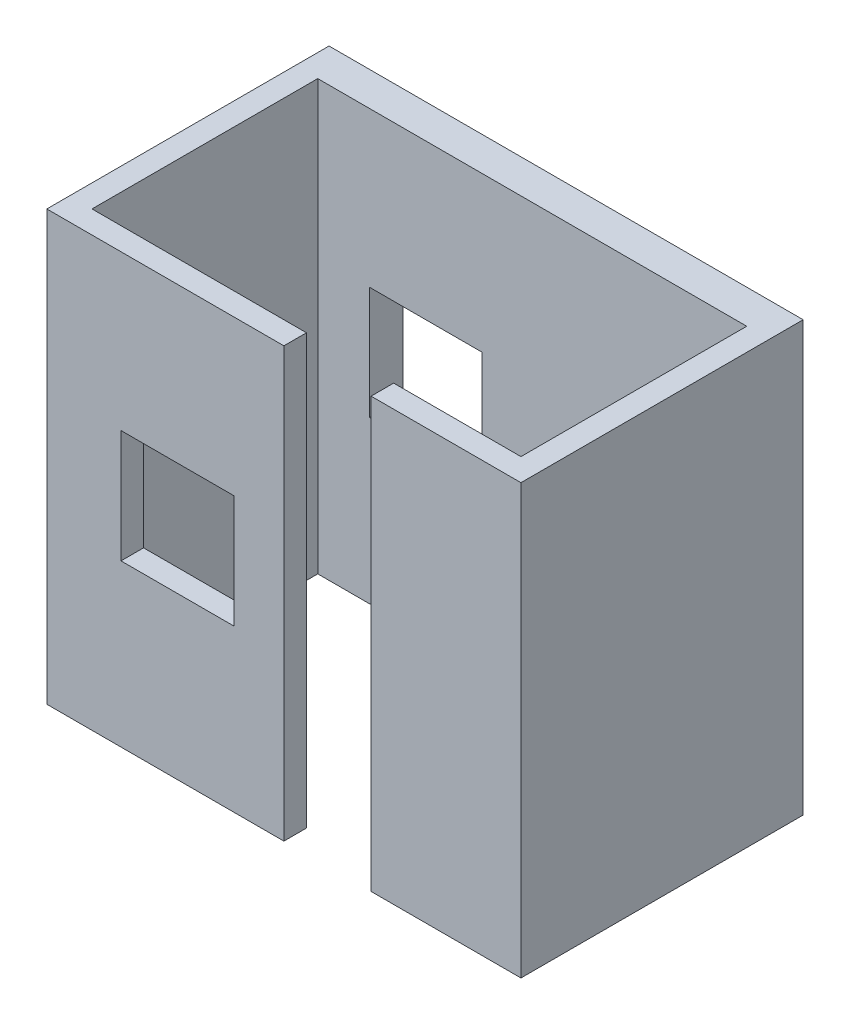
ISO-10303-21;
HEADER;
FILE_DESCRIPTION(('STEP AP214'),'2;1');
FILE_NAME('part.step','',(''),(''),'','','');
FILE_SCHEMA(('AUTOMOTIVE_DESIGN { 1 0 10303 214 1 1 1 1 }'));
ENDSEC;
DATA;
#1=APPLICATION_CONTEXT('core data for automotive mechanical design processes');
#2=APPLICATION_PROTOCOL_DEFINITION('international standard','automotive_design',2000,#1);
#3=PRODUCT_CONTEXT('',#1,'mechanical');
#4=PRODUCT('Part','Part','',(#3));
#5=PRODUCT_RELATED_PRODUCT_CATEGORY('part','',(#4));
#6=PRODUCT_DEFINITION_FORMATION('','',#4);
#7=PRODUCT_DEFINITION_CONTEXT('part definition',#1,'design');
#8=PRODUCT_DEFINITION('design','',#6,#7);
#9=PRODUCT_DEFINITION_SHAPE('','',#8);
#10=(LENGTH_UNIT() NAMED_UNIT(*) SI_UNIT(.MILLI.,.METRE.));
#11=(NAMED_UNIT(*) PLANE_ANGLE_UNIT() SI_UNIT($,.RADIAN.));
#12=(NAMED_UNIT(*) SI_UNIT($,.STERADIAN.) SOLID_ANGLE_UNIT());
#13=UNCERTAINTY_MEASURE_WITH_UNIT(LENGTH_MEASURE(1.E-05),#10,'distance_accuracy_value','');
#14=(GEOMETRIC_REPRESENTATION_CONTEXT(3) GLOBAL_UNCERTAINTY_ASSIGNED_CONTEXT((#13)) GLOBAL_UNIT_ASSIGNED_CONTEXT((#10,
#11,#12)) REPRESENTATION_CONTEXT('',''));
#15=CARTESIAN_POINT('',(0.,0.,0.));
#16=DIRECTION('',(0.,0.,1.));
#17=DIRECTION('',(1.,0.,0.));
#18=AXIS2_PLACEMENT_3D('',#15,#16,#17);
#19=CARTESIAN_POINT('',(-26.8167283653396,-11.0800335915836,1.5));
#20=DIRECTION('',(0.,1.,0.));
#21=DIRECTION('',(0.,0.,1.));
#22=AXIS2_PLACEMENT_3D('',#19,#20,#21);
#23=PLANE('',#22);
#24=DIRECTION('',(0.,0.,1.));
#25=VECTOR('',#24,1.);
#26=CARTESIAN_POINT('',(-17.3167283653395,-11.0800335915836,-17.8886346968364));
#27=LINE('',#26,#25);
#28=CARTESIAN_POINT('',(-17.3167283653395,-11.0800335915836,11.5));
#29=VERTEX_POINT('',#28);
#30=CARTESIAN_POINT('',(-17.3167283653395,-11.0800335915836,12.5));
#31=VERTEX_POINT('',#30);
#32=EDGE_CURVE('E171',#29,#31,#27,.T.);
#33=ORIENTED_EDGE('',*,*,#32,.T.);
#34=DIRECTION('',(-1.,0.,0.));
#35=VECTOR('',#34,1.);
#36=CARTESIAN_POINT('',(-27.8167283653395,-11.0800335915836,12.5));
#37=LINE('',#36,#35);
#38=CARTESIAN_POINT('',(-27.8167283653395,-11.0800335915836,12.5));
#39=VERTEX_POINT('',#38);
#40=EDGE_CURVE('E183',#31,#39,#37,.T.);
#41=ORIENTED_EDGE('',*,*,#40,.T.);
#42=DIRECTION('',(0.,0.,1.));
#43=VECTOR('',#42,1.);
#44=CARTESIAN_POINT('',(-27.8167283653395,-11.0800335915836,0.));
#45=LINE('',#44,#43);
#46=CARTESIAN_POINT('',(-27.8167283653395,-11.0800335915836,0.));
#47=VERTEX_POINT('',#46);
#48=EDGE_CURVE('E210',#47,#39,#45,.T.);
#49=ORIENTED_EDGE('',*,*,#48,.F.);
#50=DIRECTION('',(1.,0.,0.));
#51=VECTOR('',#50,1.);
#52=CARTESIAN_POINT('',(-26.8167283653396,-11.0800335915836,0.));
#53=LINE('',#52,#51);
#54=CARTESIAN_POINT('',(-6.81672836533955,-11.0800335915836,0.));
#55=VERTEX_POINT('',#54);
#56=EDGE_CURVE('E259',#47,#55,#53,.T.);
#57=ORIENTED_EDGE('',*,*,#56,.T.);
#58=DIRECTION('',(0.,0.,1.));
#59=VECTOR('',#58,1.);
#60=CARTESIAN_POINT('',(-6.81672836533955,-11.0800335915836,0.));
#61=LINE('',#60,#59);
#62=CARTESIAN_POINT('',(-6.81672836533955,-11.0800335915836,12.5));
#63=VERTEX_POINT('',#62);
#64=EDGE_CURVE('E287',#55,#63,#61,.T.);
#65=ORIENTED_EDGE('',*,*,#64,.T.);
#66=CARTESIAN_POINT('',(-13.4541961120931,-11.0800335915836,12.5));
#67=VERTEX_POINT('',#66);
#68=EDGE_CURVE('E193',#63,#67,#37,.T.);
#69=ORIENTED_EDGE('',*,*,#68,.T.);
#70=DIRECTION('',(0.,0.,1.));
#71=VECTOR('',#70,1.);
#72=CARTESIAN_POINT('',(-13.4541961120931,-11.0800335915836,-17.8886346968364));
#73=LINE('',#72,#71);
#74=CARTESIAN_POINT('',(-13.4541961120931,-11.0800335915836,11.5));
#75=VERTEX_POINT('',#74);
#76=EDGE_CURVE('E58',#75,#67,#73,.T.);
#77=ORIENTED_EDGE('',*,*,#76,.F.);
#78=DIRECTION('',(1.,0.,0.));
#79=VECTOR('',#78,1.);
#80=CARTESIAN_POINT('',(-27.8167283653395,-11.0800335915836,11.5));
#81=LINE('',#80,#79);
#82=CARTESIAN_POINT('',(-7.81672836533955,-11.0800335915836,11.5));
#83=VERTEX_POINT('',#82);
#84=EDGE_CURVE('E197',#75,#83,#81,.T.);
#85=ORIENTED_EDGE('',*,*,#84,.T.);
#86=DIRECTION('',(0.,0.,1.));
#87=VECTOR('',#86,1.);
#88=CARTESIAN_POINT('',(-7.81672836533955,-11.0800335915836,0.));
#89=LINE('',#88,#87);
#90=CARTESIAN_POINT('',(-7.81672836533955,-11.0800335915836,1.5));
#91=VERTEX_POINT('',#90);
#92=EDGE_CURVE('E223',#91,#83,#89,.T.);
#93=ORIENTED_EDGE('',*,*,#92,.F.);
#94=DIRECTION('',(1.,0.,0.));
#95=VECTOR('',#94,1.);
#96=CARTESIAN_POINT('',(-26.8167283653396,-11.0800335915836,1.5));
#97=LINE('',#96,#95);
#98=CARTESIAN_POINT('',(-26.8167283653396,-11.0800335915836,1.5));
#99=VERTEX_POINT('',#98);
#100=EDGE_CURVE('E272',#99,#91,#97,.T.);
#101=ORIENTED_EDGE('',*,*,#100,.F.);
#102=DIRECTION('',(0.,0.,1.));
#103=VECTOR('',#102,1.);
#104=CARTESIAN_POINT('',(-26.8167283653396,-11.0800335915836,0.));
#105=LINE('',#104,#103);
#106=CARTESIAN_POINT('',(-26.8167283653396,-11.0800335915836,11.5));
#107=VERTEX_POINT('',#106);
#108=EDGE_CURVE('E213',#99,#107,#105,.T.);
#109=ORIENTED_EDGE('',*,*,#108,.T.);
#110=EDGE_CURVE('E187',#107,#29,#81,.T.);
#111=ORIENTED_EDGE('',*,*,#110,.T.);
#112=EDGE_LOOP('',(#33,#41,#49,#57,#65,#69,#77,#85,#93,#101,#109,#111));
#113=FACE_BOUND('',#112,.T.);
#114=ADVANCED_FACE('F33',(#113),#23,.F.);
#115=CARTESIAN_POINT('',(-26.8167283653396,7.91996640841636,1.5));
#116=DIRECTION('',(0.,-1.,0.));
#117=DIRECTION('',(0.,0.,-1.));
#118=AXIS2_PLACEMENT_3D('',#115,#116,#117);
#119=PLANE('',#118);
#120=DIRECTION('',(0.,0.,1.));
#121=VECTOR('',#120,1.);
#122=CARTESIAN_POINT('',(-17.3167283653395,7.91996640841636,-17.8886346968364));
#123=LINE('',#122,#121);
#124=CARTESIAN_POINT('',(-17.3167283653395,7.91996640841636,11.5));
#125=VERTEX_POINT('',#124);
#126=CARTESIAN_POINT('',(-17.3167283653395,7.91996640841636,12.5));
#127=VERTEX_POINT('',#126);
#128=EDGE_CURVE('E50',#125,#127,#123,.T.);
#129=ORIENTED_EDGE('',*,*,#128,.F.);
#130=DIRECTION('',(-1.,0.,0.));
#131=VECTOR('',#130,1.);
#132=CARTESIAN_POINT('',(-27.8167283653395,7.91996640841636,11.5));
#133=LINE('',#132,#131);
#134=CARTESIAN_POINT('',(-26.8167283653396,7.91996640841636,11.5));
#135=VERTEX_POINT('',#134);
#136=EDGE_CURVE('E309',#125,#135,#133,.T.);
#137=ORIENTED_EDGE('',*,*,#136,.T.);
#138=DIRECTION('',(0.,0.,1.));
#139=VECTOR('',#138,1.);
#140=CARTESIAN_POINT('',(-26.8167283653396,7.91996640841636,0.));
#141=LINE('',#140,#139);
#142=CARTESIAN_POINT('',(-26.8167283653396,7.91996640841636,1.5));
#143=VERTEX_POINT('',#142);
#144=EDGE_CURVE('E207',#143,#135,#141,.T.);
#145=ORIENTED_EDGE('',*,*,#144,.F.);
#146=DIRECTION('',(-1.,0.,0.));
#147=VECTOR('',#146,1.);
#148=CARTESIAN_POINT('',(-26.8167283653396,7.91996640841636,1.5));
#149=LINE('',#148,#147);
#150=CARTESIAN_POINT('',(-7.81672836533955,7.91996640841636,1.5));
#151=VERTEX_POINT('',#150);
#152=EDGE_CURVE('E11',#151,#143,#149,.T.);
#153=ORIENTED_EDGE('',*,*,#152,.F.);
#154=DIRECTION('',(0.,0.,1.));
#155=VECTOR('',#154,1.);
#156=CARTESIAN_POINT('',(-7.81672836533955,7.91996640841636,0.));
#157=LINE('',#156,#155);
#158=CARTESIAN_POINT('',(-7.81672836533955,7.91996640841636,11.5));
#159=VERTEX_POINT('',#158);
#160=EDGE_CURVE('E229',#151,#159,#157,.T.);
#161=ORIENTED_EDGE('',*,*,#160,.T.);
#162=CARTESIAN_POINT('',(-13.4541961120931,7.91996640841636,11.5));
#163=VERTEX_POINT('',#162);
#164=EDGE_CURVE('E305',#159,#163,#133,.T.);
#165=ORIENTED_EDGE('',*,*,#164,.T.);
#166=DIRECTION('',(0.,0.,1.));
#167=VECTOR('',#166,1.);
#168=CARTESIAN_POINT('',(-13.4541961120931,7.91996640841636,-17.8886346968364));
#169=LINE('',#168,#167);
#170=CARTESIAN_POINT('',(-13.4541961120931,7.91996640841636,12.5));
#171=VERTEX_POINT('',#170);
#172=EDGE_CURVE('E177',#163,#171,#169,.T.);
#173=ORIENTED_EDGE('',*,*,#172,.T.);
#174=DIRECTION('',(1.,0.,0.));
#175=VECTOR('',#174,1.);
#176=CARTESIAN_POINT('',(-27.8167283653395,7.91996640841636,12.5));
#177=LINE('',#176,#175);
#178=CARTESIAN_POINT('',(-6.81672836533955,7.91996640841636,12.5));
#179=VERTEX_POINT('',#178);
#180=EDGE_CURVE('E302',#171,#179,#177,.T.);
#181=ORIENTED_EDGE('',*,*,#180,.T.);
#182=DIRECTION('',(0.,0.,1.));
#183=VECTOR('',#182,1.);
#184=CARTESIAN_POINT('',(-6.81672836533955,7.91996640841636,0.));
#185=LINE('',#184,#183);
#186=CARTESIAN_POINT('',(-6.81672836533955,7.91996640841636,0.));
#187=VERTEX_POINT('',#186);
#188=EDGE_CURVE('E226',#187,#179,#185,.T.);
#189=ORIENTED_EDGE('',*,*,#188,.F.);
#190=DIRECTION('',(-1.,0.,0.));
#191=VECTOR('',#190,1.);
#192=CARTESIAN_POINT('',(-26.8167283653396,7.91996640841636,0.));
#193=LINE('',#192,#191);
#194=CARTESIAN_POINT('',(-27.8167283653395,7.91996640841636,0.));
#195=VERTEX_POINT('',#194);
#196=EDGE_CURVE('E273',#187,#195,#193,.T.);
#197=ORIENTED_EDGE('',*,*,#196,.T.);
#198=DIRECTION('',(0.,0.,1.));
#199=VECTOR('',#198,1.);
#200=CARTESIAN_POINT('',(-27.8167283653395,7.91996640841636,0.));
#201=LINE('',#200,#199);
#202=CARTESIAN_POINT('',(-27.8167283653395,7.91996640841636,12.5));
#203=VERTEX_POINT('',#202);
#204=EDGE_CURVE('E367',#195,#203,#201,.T.);
#205=ORIENTED_EDGE('',*,*,#204,.T.);
#206=EDGE_CURVE('E310',#203,#127,#177,.T.);
#207=ORIENTED_EDGE('',*,*,#206,.T.);
#208=EDGE_LOOP('',(#129,#137,#145,#153,#161,#165,#173,#181,#189,#197,#205,#207));
#209=FACE_BOUND('',#208,.T.);
#210=ADVANCED_FACE('F299',(#209),#119,.F.);
#211=CARTESIAN_POINT('',(-27.8167283653395,-32.1038296332123,11.5));
#212=DIRECTION('',(0.,0.,-1.));
#213=DIRECTION('',(-1.,0.,0.));
#214=AXIS2_PLACEMENT_3D('',#211,#212,#213);
#215=PLANE('',#214);
#216=DIRECTION('',(0.,-1.,0.));
#217=VECTOR('',#216,1.);
#218=CARTESIAN_POINT('',(-19.5312867109825,1.06264686566049,11.5));
#219=LINE('',#218,#217);
#220=CARTESIAN_POINT('',(-19.5312867109825,1.06264686566049,11.5));
#221=VERTEX_POINT('',#220);
#222=CARTESIAN_POINT('',(-19.5312867109825,-3.93735313433951,11.5));
#223=VERTEX_POINT('',#222);
#224=EDGE_CURVE('E332',#221,#223,#219,.T.);
#225=ORIENTED_EDGE('',*,*,#224,.F.);
#226=DIRECTION('',(1.,0.,0.));
#227=VECTOR('',#226,1.);
#228=CARTESIAN_POINT('',(-19.5312867109825,1.06264686566049,11.5));
#229=LINE('',#228,#227);
#230=CARTESIAN_POINT('',(-24.5312867109825,1.06264686566049,11.5));
#231=VERTEX_POINT('',#230);
#232=EDGE_CURVE('E322',#231,#221,#229,.T.);
#233=ORIENTED_EDGE('',*,*,#232,.F.);
#234=DIRECTION('',(0.,1.,0.));
#235=VECTOR('',#234,1.);
#236=CARTESIAN_POINT('',(-24.5312867109825,1.06264686566049,11.5));
#237=LINE('',#236,#235);
#238=CARTESIAN_POINT('',(-24.5312867109825,-3.93735313433951,11.5));
#239=VERTEX_POINT('',#238);
#240=EDGE_CURVE('E326',#239,#231,#237,.T.);
#241=ORIENTED_EDGE('',*,*,#240,.F.);
#242=DIRECTION('',(-1.,0.,0.));
#243=VECTOR('',#242,1.);
#244=CARTESIAN_POINT('',(-19.5312867109825,-3.93735313433951,11.5));
#245=LINE('',#244,#243);
#246=EDGE_CURVE('E329',#223,#239,#245,.T.);
#247=ORIENTED_EDGE('',*,*,#246,.F.);
#248=EDGE_LOOP('',(#225,#233,#241,#247));
#249=FACE_BOUND('',#248,.T.);
#250=ORIENTED_EDGE('',*,*,#136,.F.);
#251=DIRECTION('',(0.,-1.,0.));
#252=VECTOR('',#251,1.);
#253=CARTESIAN_POINT('',(-17.3167283653395,-32.1038296332123,11.5));
#254=LINE('',#253,#252);
#255=EDGE_CURVE('E334',#125,#29,#254,.T.);
#256=ORIENTED_EDGE('',*,*,#255,.T.);
#257=ORIENTED_EDGE('',*,*,#110,.F.);
#258=DIRECTION('',(0.,1.,0.));
#259=VECTOR('',#258,1.);
#260=CARTESIAN_POINT('',(-26.8167283653396,7.91996640841636,11.5));
#261=LINE('',#260,#259);
#262=EDGE_CURVE('E196',#107,#135,#261,.T.);
#263=ORIENTED_EDGE('',*,*,#262,.T.);
#264=EDGE_LOOP('',(#250,#256,#257,#263));
#265=FACE_BOUND('',#264,.T.);
#266=ADVANCED_FACE('F364',(#249,#265),#215,.T.);
#267=ORIENTED_EDGE('',*,*,#84,.F.);
#268=DIRECTION('',(0.,1.,0.));
#269=VECTOR('',#268,1.);
#270=CARTESIAN_POINT('',(-13.4541961120931,-32.1038296332123,11.5));
#271=LINE('',#270,#269);
#272=EDGE_CURVE('E346',#75,#163,#271,.T.);
#273=ORIENTED_EDGE('',*,*,#272,.T.);
#274=ORIENTED_EDGE('',*,*,#164,.F.);
#275=DIRECTION('',(0.,-1.,0.));
#276=VECTOR('',#275,1.);
#277=CARTESIAN_POINT('',(-7.81672836533955,7.91996640841636,11.5));
#278=LINE('',#277,#276);
#279=EDGE_CURVE('E216',#159,#83,#278,.T.);
#280=ORIENTED_EDGE('',*,*,#279,.T.);
#281=EDGE_LOOP('',(#267,#273,#274,#280));
#282=FACE_BOUND('',#281,.T.);
#283=ADVANCED_FACE('F356',(#282),#215,.T.);
#284=CARTESIAN_POINT('',(-27.8167283653395,-32.1038296332123,12.5));
#285=DIRECTION('',(0.,0.,1.));
#286=DIRECTION('',(1.,0.,0.));
#287=AXIS2_PLACEMENT_3D('',#284,#285,#286);
#288=PLANE('',#287);
#289=DIRECTION('',(0.,-1.,0.));
#290=VECTOR('',#289,1.);
#291=CARTESIAN_POINT('',(-19.5312867109825,1.06264686566049,12.5));
#292=LINE('',#291,#290);
#293=CARTESIAN_POINT('',(-19.5312867109825,1.06264686566049,12.5));
#294=VERTEX_POINT('',#293);
#295=CARTESIAN_POINT('',(-19.5312867109825,-3.93735313433951,12.5));
#296=VERTEX_POINT('',#295);
#297=EDGE_CURVE('E325',#294,#296,#292,.T.);
#298=ORIENTED_EDGE('',*,*,#297,.T.);
#299=DIRECTION('',(-1.,0.,0.));
#300=VECTOR('',#299,1.);
#301=CARTESIAN_POINT('',(-19.5312867109825,-3.93735313433951,12.5));
#302=LINE('',#301,#300);
#303=CARTESIAN_POINT('',(-24.5312867109825,-3.93735313433951,12.5));
#304=VERTEX_POINT('',#303);
#305=EDGE_CURVE('E340',#296,#304,#302,.T.);
#306=ORIENTED_EDGE('',*,*,#305,.T.);
#307=DIRECTION('',(0.,1.,0.));
#308=VECTOR('',#307,1.);
#309=CARTESIAN_POINT('',(-24.5312867109825,1.06264686566049,12.5));
#310=LINE('',#309,#308);
#311=CARTESIAN_POINT('',(-24.5312867109825,1.06264686566049,12.5));
#312=VERTEX_POINT('',#311);
#313=EDGE_CURVE('E337',#304,#312,#310,.T.);
#314=ORIENTED_EDGE('',*,*,#313,.T.);
#315=DIRECTION('',(1.,0.,0.));
#316=VECTOR('',#315,1.);
#317=CARTESIAN_POINT('',(-19.5312867109825,1.06264686566049,12.5));
#318=LINE('',#317,#316);
#319=EDGE_CURVE('E316',#312,#294,#318,.T.);
#320=ORIENTED_EDGE('',*,*,#319,.T.);
#321=EDGE_LOOP('',(#298,#306,#314,#320));
#322=FACE_BOUND('',#321,.T.);
#323=ORIENTED_EDGE('',*,*,#40,.F.);
#324=DIRECTION('',(0.,1.,0.));
#325=VECTOR('',#324,1.);
#326=CARTESIAN_POINT('',(-17.3167283653395,7.91996640841636,12.5));
#327=LINE('',#326,#325);
#328=EDGE_CURVE('E168',#31,#127,#327,.T.);
#329=ORIENTED_EDGE('',*,*,#328,.T.);
#330=ORIENTED_EDGE('',*,*,#206,.F.);
#331=DIRECTION('',(0.,1.,0.));
#332=VECTOR('',#331,1.);
#333=CARTESIAN_POINT('',(-27.8167283653395,-32.1038296332123,12.5));
#334=LINE('',#333,#332);
#335=EDGE_CURVE('E192',#39,#203,#334,.T.);
#336=ORIENTED_EDGE('',*,*,#335,.F.);
#337=EDGE_LOOP('',(#323,#329,#330,#336));
#338=FACE_BOUND('',#337,.T.);
#339=ADVANCED_FACE('F190',(#322,#338),#288,.T.);
#340=ORIENTED_EDGE('',*,*,#180,.F.);
#341=DIRECTION('',(0.,-1.,0.));
#342=VECTOR('',#341,1.);
#343=CARTESIAN_POINT('',(-13.4541961120931,7.91996640841636,12.5));
#344=LINE('',#343,#342);
#345=EDGE_CURVE('E178',#171,#67,#344,.T.);
#346=ORIENTED_EDGE('',*,*,#345,.T.);
#347=ORIENTED_EDGE('',*,*,#68,.F.);
#348=DIRECTION('',(0.,1.,0.));
#349=VECTOR('',#348,1.);
#350=CARTESIAN_POINT('',(-6.81672836533955,-32.1038296332123,12.5));
#351=LINE('',#350,#349);
#352=EDGE_CURVE('E296',#63,#179,#351,.T.);
#353=ORIENTED_EDGE('',*,*,#352,.T.);
#354=EDGE_LOOP('',(#340,#346,#347,#353));
#355=FACE_BOUND('',#354,.T.);
#356=ADVANCED_FACE('F304',(#355),#288,.T.);
#357=CARTESIAN_POINT('',(-26.8167283653396,-11.0800335915836,1.5));
#358=DIRECTION('',(0.,0.,1.));
#359=DIRECTION('',(1.,0.,0.));
#360=AXIS2_PLACEMENT_3D('',#357,#358,#359);
#361=PLANE('',#360);
#362=ORIENTED_EDGE('',*,*,#152,.T.);
#363=DIRECTION('',(0.,-1.,0.));
#364=VECTOR('',#363,1.);
#365=CARTESIAN_POINT('',(-26.8167283653396,7.91996640841636,1.5));
#366=LINE('',#365,#364);
#367=EDGE_CURVE('E36',#143,#99,#366,.T.);
#368=ORIENTED_EDGE('',*,*,#367,.T.);
#369=ORIENTED_EDGE('',*,*,#100,.T.);
#370=DIRECTION('',(0.,1.,0.));
#371=VECTOR('',#370,1.);
#372=CARTESIAN_POINT('',(-7.81672836533955,7.91996640841636,1.5));
#373=LINE('',#372,#371);
#374=EDGE_CURVE('E42',#91,#151,#373,.T.);
#375=ORIENTED_EDGE('',*,*,#374,.T.);
#376=EDGE_LOOP('',(#362,#368,#369,#375));
#377=FACE_BOUND('',#376,.T.);
#378=DIRECTION('',(0.,1.,0.));
#379=VECTOR('',#378,1.);
#380=CARTESIAN_POINT('',(-24.5312867109825,1.06264686566049,1.5));
#381=LINE('',#380,#379);
#382=CARTESIAN_POINT('',(-24.5312867109825,-3.93735313433951,1.5));
#383=VERTEX_POINT('',#382);
#384=CARTESIAN_POINT('',(-24.5312867109825,1.06264686566049,1.5));
#385=VERTEX_POINT('',#384);
#386=EDGE_CURVE('E234',#383,#385,#381,.T.);
#387=ORIENTED_EDGE('',*,*,#386,.T.);
#388=DIRECTION('',(1.,0.,0.));
#389=VECTOR('',#388,1.);
#390=CARTESIAN_POINT('',(-19.5312867109825,1.06264686566049,1.5));
#391=LINE('',#390,#389);
#392=CARTESIAN_POINT('',(-19.5312867109825,1.06264686566049,1.5));
#393=VERTEX_POINT('',#392);
#394=EDGE_CURVE('E237',#385,#393,#391,.T.);
#395=ORIENTED_EDGE('',*,*,#394,.T.);
#396=DIRECTION('',(0.,-1.,0.));
#397=VECTOR('',#396,1.);
#398=CARTESIAN_POINT('',(-19.5312867109825,1.06264686566049,1.5));
#399=LINE('',#398,#397);
#400=CARTESIAN_POINT('',(-19.5312867109825,-3.93735313433951,1.5));
#401=VERTEX_POINT('',#400);
#402=EDGE_CURVE('E241',#393,#401,#399,.T.);
#403=ORIENTED_EDGE('',*,*,#402,.T.);
#404=DIRECTION('',(-1.,0.,0.));
#405=VECTOR('',#404,1.);
#406=CARTESIAN_POINT('',(-19.5312867109825,-3.93735313433951,1.5));
#407=LINE('',#406,#405);
#408=EDGE_CURVE('E244',#401,#383,#407,.T.);
#409=ORIENTED_EDGE('',*,*,#408,.T.);
#410=EDGE_LOOP('',(#387,#395,#403,#409));
#411=FACE_BOUND('',#410,.T.);
#412=ADVANCED_FACE('F397',(#377,#411),#361,.T.);
#413=CARTESIAN_POINT('',(-26.8167283653396,-11.0800335915836,0.));
#414=DIRECTION('',(0.,0.,1.));
#415=DIRECTION('',(1.,0.,0.));
#416=AXIS2_PLACEMENT_3D('',#413,#414,#415);
#417=PLANE('',#416);
#418=DIRECTION('',(1.,0.,0.));
#419=VECTOR('',#418,1.);
#420=CARTESIAN_POINT('',(-19.5312867109825,1.06264686566049,0.));
#421=LINE('',#420,#419);
#422=CARTESIAN_POINT('',(-24.5312867109825,1.06264686566049,0.));
#423=VERTEX_POINT('',#422);
#424=CARTESIAN_POINT('',(-19.5312867109825,1.06264686566049,0.));
#425=VERTEX_POINT('',#424);
#426=EDGE_CURVE('E249',#423,#425,#421,.T.);
#427=ORIENTED_EDGE('',*,*,#426,.F.);
#428=DIRECTION('',(0.,1.,0.));
#429=VECTOR('',#428,1.);
#430=CARTESIAN_POINT('',(-24.5312867109825,1.06264686566049,0.));
#431=LINE('',#430,#429);
#432=CARTESIAN_POINT('',(-24.5312867109825,-3.93735313433951,0.));
#433=VERTEX_POINT('',#432);
#434=EDGE_CURVE('E232',#433,#423,#431,.T.);
#435=ORIENTED_EDGE('',*,*,#434,.F.);
#436=DIRECTION('',(-1.,0.,0.));
#437=VECTOR('',#436,1.);
#438=CARTESIAN_POINT('',(-19.5312867109825,-3.93735313433951,0.));
#439=LINE('',#438,#437);
#440=CARTESIAN_POINT('',(-19.5312867109825,-3.93735313433951,0.));
#441=VERTEX_POINT('',#440);
#442=EDGE_CURVE('E238',#441,#433,#439,.T.);
#443=ORIENTED_EDGE('',*,*,#442,.F.);
#444=DIRECTION('',(0.,-1.,0.));
#445=VECTOR('',#444,1.);
#446=CARTESIAN_POINT('',(-19.5312867109825,1.06264686566049,0.));
#447=LINE('',#446,#445);
#448=EDGE_CURVE('E252',#425,#441,#447,.T.);
#449=ORIENTED_EDGE('',*,*,#448,.F.);
#450=EDGE_LOOP('',(#427,#435,#443,#449));
#451=FACE_BOUND('',#450,.T.);
#452=ORIENTED_EDGE('',*,*,#56,.F.);
#453=DIRECTION('',(0.,-1.,0.));
#454=VECTOR('',#453,1.);
#455=CARTESIAN_POINT('',(-27.8167283653395,7.91996640841636,0.));
#456=LINE('',#455,#454);
#457=EDGE_CURVE('E204',#195,#47,#456,.T.);
#458=ORIENTED_EDGE('',*,*,#457,.F.);
#459=ORIENTED_EDGE('',*,*,#196,.F.);
#460=DIRECTION('',(0.,1.,0.));
#461=VECTOR('',#460,1.);
#462=CARTESIAN_POINT('',(-6.81672836533955,7.91996640841636,0.));
#463=LINE('',#462,#461);
#464=EDGE_CURVE('E220',#55,#187,#463,.T.);
#465=ORIENTED_EDGE('',*,*,#464,.F.);
#466=EDGE_LOOP('',(#452,#458,#459,#465));
#467=FACE_BOUND('',#466,.T.);
#468=ADVANCED_FACE('F298',(#451,#467),#417,.F.);
#469=CARTESIAN_POINT('',(-24.5312867109825,1.06264686566049,1.5));
#470=DIRECTION('',(-1.,0.,0.));
#471=DIRECTION('',(0.,0.,1.));
#472=AXIS2_PLACEMENT_3D('',#469,#470,#471);
#473=PLANE('',#472);
#474=ORIENTED_EDGE('',*,*,#434,.T.);
#475=DIRECTION('',(0.,0.,-1.));
#476=VECTOR('',#475,1.);
#477=CARTESIAN_POINT('',(-24.5312867109825,1.06264686566049,1.5));
#478=LINE('',#477,#476);
#479=EDGE_CURVE('E247',#385,#423,#478,.T.);
#480=ORIENTED_EDGE('',*,*,#479,.F.);
#481=ORIENTED_EDGE('',*,*,#386,.F.);
#482=DIRECTION('',(0.,0.,-1.));
#483=VECTOR('',#482,1.);
#484=CARTESIAN_POINT('',(-24.5312867109825,-3.93735313433951,1.5));
#485=LINE('',#484,#483);
#486=EDGE_CURVE('E257',#383,#433,#485,.T.);
#487=ORIENTED_EDGE('',*,*,#486,.T.);
#488=EDGE_LOOP('',(#474,#480,#481,#487));
#489=FACE_BOUND('',#488,.T.);
#490=ADVANCED_FACE('F396',(#489),#473,.F.);
#491=CARTESIAN_POINT('',(-19.5312867109825,-3.93735313433951,1.5));
#492=DIRECTION('',(0.,-1.,0.));
#493=DIRECTION('',(0.,0.,-1.));
#494=AXIS2_PLACEMENT_3D('',#491,#492,#493);
#495=PLANE('',#494);
#496=ORIENTED_EDGE('',*,*,#442,.T.);
#497=ORIENTED_EDGE('',*,*,#486,.F.);
#498=ORIENTED_EDGE('',*,*,#408,.F.);
#499=DIRECTION('',(0.,0.,-1.));
#500=VECTOR('',#499,1.);
#501=CARTESIAN_POINT('',(-19.5312867109825,-3.93735313433951,1.5));
#502=LINE('',#501,#500);
#503=EDGE_CURVE('E260',#401,#441,#502,.T.);
#504=ORIENTED_EDGE('',*,*,#503,.T.);
#505=EDGE_LOOP('',(#496,#497,#498,#504));
#506=FACE_BOUND('',#505,.T.);
#507=ADVANCED_FACE('F403',(#506),#495,.F.);
#508=CARTESIAN_POINT('',(-19.5312867109825,1.06264686566049,1.5));
#509=DIRECTION('',(1.,0.,0.));
#510=DIRECTION('',(0.,0.,-1.));
#511=AXIS2_PLACEMENT_3D('',#508,#509,#510);
#512=PLANE('',#511);
#513=ORIENTED_EDGE('',*,*,#448,.T.);
#514=ORIENTED_EDGE('',*,*,#503,.F.);
#515=ORIENTED_EDGE('',*,*,#402,.F.);
#516=DIRECTION('',(0.,0.,-1.));
#517=VECTOR('',#516,1.);
#518=CARTESIAN_POINT('',(-19.5312867109825,1.06264686566049,1.5));
#519=LINE('',#518,#517);
#520=EDGE_CURVE('E262',#393,#425,#519,.T.);
#521=ORIENTED_EDGE('',*,*,#520,.T.);
#522=EDGE_LOOP('',(#513,#514,#515,#521));
#523=FACE_BOUND('',#522,.T.);
#524=ADVANCED_FACE('F408',(#523),#512,.F.);
#525=CARTESIAN_POINT('',(-19.5312867109825,1.06264686566049,1.5));
#526=DIRECTION('',(0.,1.,0.));
#527=DIRECTION('',(0.,0.,1.));
#528=AXIS2_PLACEMENT_3D('',#525,#526,#527);
#529=PLANE('',#528);
#530=ORIENTED_EDGE('',*,*,#426,.T.);
#531=ORIENTED_EDGE('',*,*,#520,.F.);
#532=ORIENTED_EDGE('',*,*,#394,.F.);
#533=ORIENTED_EDGE('',*,*,#479,.T.);
#534=EDGE_LOOP('',(#530,#531,#532,#533));
#535=FACE_BOUND('',#534,.T.);
#536=ADVANCED_FACE('F405',(#535),#529,.F.);
#537=CARTESIAN_POINT('',(-7.81672836533955,7.91996640841636,0.));
#538=DIRECTION('',(-1.,0.,0.));
#539=DIRECTION('',(0.,0.,1.));
#540=AXIS2_PLACEMENT_3D('',#537,#538,#539);
#541=PLANE('',#540);
#542=ORIENTED_EDGE('',*,*,#374,.F.);
#543=ORIENTED_EDGE('',*,*,#92,.T.);
#544=ORIENTED_EDGE('',*,*,#279,.F.);
#545=ORIENTED_EDGE('',*,*,#160,.F.);
#546=EDGE_LOOP('',(#542,#543,#544,#545));
#547=FACE_BOUND('',#546,.T.);
#548=ADVANCED_FACE('F360',(#547),#541,.T.);
#549=CARTESIAN_POINT('',(-6.81672836533955,7.91996640841636,0.));
#550=DIRECTION('',(1.,0.,0.));
#551=DIRECTION('',(0.,1.,0.));
#552=AXIS2_PLACEMENT_3D('',#549,#550,#551);
#553=PLANE('',#552);
#554=ORIENTED_EDGE('',*,*,#188,.T.);
#555=ORIENTED_EDGE('',*,*,#352,.F.);
#556=ORIENTED_EDGE('',*,*,#64,.F.);
#557=ORIENTED_EDGE('',*,*,#464,.T.);
#558=EDGE_LOOP('',(#554,#555,#556,#557));
#559=FACE_BOUND('',#558,.T.);
#560=ADVANCED_FACE('F294',(#559),#553,.T.);
#561=CARTESIAN_POINT('',(-26.8167283653396,7.91996640841636,0.));
#562=DIRECTION('',(1.,0.,0.));
#563=DIRECTION('',(0.,0.,-1.));
#564=AXIS2_PLACEMENT_3D('',#561,#562,#563);
#565=PLANE('',#564);
#566=ORIENTED_EDGE('',*,*,#367,.F.);
#567=ORIENTED_EDGE('',*,*,#144,.T.);
#568=ORIENTED_EDGE('',*,*,#262,.F.);
#569=ORIENTED_EDGE('',*,*,#108,.F.);
#570=EDGE_LOOP('',(#566,#567,#568,#569));
#571=FACE_BOUND('',#570,.T.);
#572=ADVANCED_FACE('F372',(#571),#565,.T.);
#573=CARTESIAN_POINT('',(-27.8167283653395,7.91996640841636,0.));
#574=DIRECTION('',(-1.,0.,0.));
#575=DIRECTION('',(0.,0.,1.));
#576=AXIS2_PLACEMENT_3D('',#573,#574,#575);
#577=PLANE('',#576);
#578=ORIENTED_EDGE('',*,*,#48,.T.);
#579=ORIENTED_EDGE('',*,*,#335,.T.);
#580=ORIENTED_EDGE('',*,*,#204,.F.);
#581=ORIENTED_EDGE('',*,*,#457,.T.);
#582=EDGE_LOOP('',(#578,#579,#580,#581));
#583=FACE_BOUND('',#582,.T.);
#584=ADVANCED_FACE('F369',(#583),#577,.T.);
#585=CARTESIAN_POINT('',(-19.5312867109825,1.06264686566049,12.5));
#586=DIRECTION('',(1.,0.,0.));
#587=DIRECTION('',(0.,0.,-1.));
#588=AXIS2_PLACEMENT_3D('',#585,#586,#587);
#589=PLANE('',#588);
#590=ORIENTED_EDGE('',*,*,#224,.T.);
#591=DIRECTION('',(0.,0.,-1.));
#592=VECTOR('',#591,1.);
#593=CARTESIAN_POINT('',(-19.5312867109825,-3.93735313433951,12.5));
#594=LINE('',#593,#592);
#595=EDGE_CURVE('E312',#296,#223,#594,.T.);
#596=ORIENTED_EDGE('',*,*,#595,.F.);
#597=ORIENTED_EDGE('',*,*,#297,.F.);
#598=DIRECTION('',(0.,0.,-1.));
#599=VECTOR('',#598,1.);
#600=CARTESIAN_POINT('',(-19.5312867109825,1.06264686566049,12.5));
#601=LINE('',#600,#599);
#602=EDGE_CURVE('E320',#294,#221,#601,.T.);
#603=ORIENTED_EDGE('',*,*,#602,.T.);
#604=EDGE_LOOP('',(#590,#596,#597,#603));
#605=FACE_BOUND('',#604,.T.);
#606=ADVANCED_FACE('F371',(#605),#589,.F.);
#607=CARTESIAN_POINT('',(-19.5312867109825,1.06264686566049,12.5));
#608=DIRECTION('',(0.,1.,0.));
#609=DIRECTION('',(0.,0.,1.));
#610=AXIS2_PLACEMENT_3D('',#607,#608,#609);
#611=PLANE('',#610);
#612=ORIENTED_EDGE('',*,*,#232,.T.);
#613=ORIENTED_EDGE('',*,*,#602,.F.);
#614=ORIENTED_EDGE('',*,*,#319,.F.);
#615=DIRECTION('',(0.,0.,-1.));
#616=VECTOR('',#615,1.);
#617=CARTESIAN_POINT('',(-24.5312867109825,1.06264686566049,12.5));
#618=LINE('',#617,#616);
#619=EDGE_CURVE('E318',#312,#231,#618,.T.);
#620=ORIENTED_EDGE('',*,*,#619,.T.);
#621=EDGE_LOOP('',(#612,#613,#614,#620));
#622=FACE_BOUND('',#621,.T.);
#623=ADVANCED_FACE('F378',(#622),#611,.F.);
#624=CARTESIAN_POINT('',(-24.5312867109825,1.06264686566049,12.5));
#625=DIRECTION('',(-1.,0.,0.));
#626=DIRECTION('',(0.,0.,1.));
#627=AXIS2_PLACEMENT_3D('',#624,#625,#626);
#628=PLANE('',#627);
#629=ORIENTED_EDGE('',*,*,#240,.T.);
#630=ORIENTED_EDGE('',*,*,#619,.F.);
#631=ORIENTED_EDGE('',*,*,#313,.F.);
#632=DIRECTION('',(0.,0.,-1.));
#633=VECTOR('',#632,1.);
#634=CARTESIAN_POINT('',(-24.5312867109825,-3.93735313433951,12.5));
#635=LINE('',#634,#633);
#636=EDGE_CURVE('E315',#304,#239,#635,.T.);
#637=ORIENTED_EDGE('',*,*,#636,.T.);
#638=EDGE_LOOP('',(#629,#630,#631,#637));
#639=FACE_BOUND('',#638,.T.);
#640=ADVANCED_FACE('F448',(#639),#628,.F.);
#641=CARTESIAN_POINT('',(-19.5312867109825,-3.93735313433951,12.5));
#642=DIRECTION('',(0.,-1.,0.));
#643=DIRECTION('',(0.,0.,-1.));
#644=AXIS2_PLACEMENT_3D('',#641,#642,#643);
#645=PLANE('',#644);
#646=ORIENTED_EDGE('',*,*,#246,.T.);
#647=ORIENTED_EDGE('',*,*,#636,.F.);
#648=ORIENTED_EDGE('',*,*,#305,.F.);
#649=ORIENTED_EDGE('',*,*,#595,.T.);
#650=EDGE_LOOP('',(#646,#647,#648,#649));
#651=FACE_BOUND('',#650,.T.);
#652=ADVANCED_FACE('F458',(#651),#645,.F.);
#653=CARTESIAN_POINT('',(-13.4541961120931,7.91996640841636,-17.8886346968364));
#654=DIRECTION('',(-1.,0.,0.));
#655=DIRECTION('',(0.,0.,1.));
#656=AXIS2_PLACEMENT_3D('',#653,#654,#655);
#657=PLANE('',#656);
#658=ORIENTED_EDGE('',*,*,#76,.T.);
#659=ORIENTED_EDGE('',*,*,#345,.F.);
#660=ORIENTED_EDGE('',*,*,#172,.F.);
#661=ORIENTED_EDGE('',*,*,#272,.F.);
#662=EDGE_LOOP('',(#658,#659,#660,#661));
#663=FACE_BOUND('',#662,.T.);
#664=ADVANCED_FACE('F467',(#663),#657,.T.);
#665=CARTESIAN_POINT('',(-17.3167283653395,7.91996640841636,-17.8886346968364));
#666=DIRECTION('',(1.,0.,0.));
#667=DIRECTION('',(0.,0.,-1.));
#668=AXIS2_PLACEMENT_3D('',#665,#666,#667);
#669=PLANE('',#668);
#670=ORIENTED_EDGE('',*,*,#128,.T.);
#671=ORIENTED_EDGE('',*,*,#328,.F.);
#672=ORIENTED_EDGE('',*,*,#32,.F.);
#673=ORIENTED_EDGE('',*,*,#255,.F.);
#674=EDGE_LOOP('',(#670,#671,#672,#673));
#675=FACE_BOUND('',#674,.T.);
#676=ADVANCED_FACE('F170',(#675),#669,.T.);
#677=CLOSED_SHELL('',(#114,#210,#266,#283,#339,#356,#412,#468,#490,#507,#524,#536,#548,#560,
#572,#584,#606,#623,#640,#652,#664,#676));
#678=MANIFOLD_SOLID_BREP('B2',#677);
#679=ADVANCED_BREP_SHAPE_REPRESENTATION('',(#18,#678),#14);
#680=SHAPE_DEFINITION_REPRESENTATION(#9,#679);
ENDSEC;
END-ISO-10303-21;
